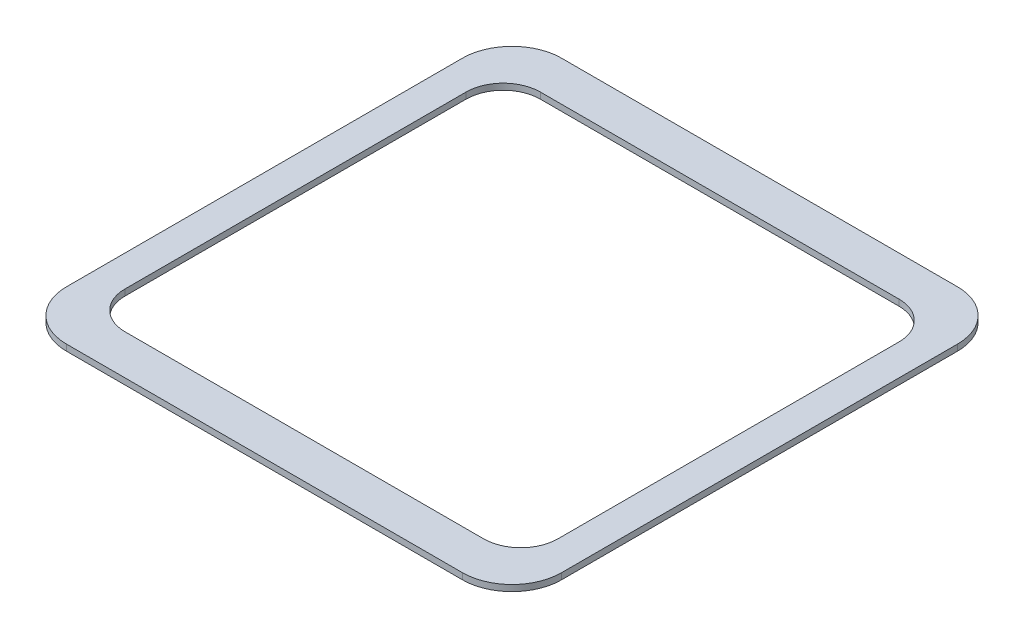
ISO-10303-21;
HEADER;
FILE_DESCRIPTION(('STEP AP214'),'2;1');
FILE_NAME('part.step','',(''),(''),'','','');
FILE_SCHEMA(('AUTOMOTIVE_DESIGN { 1 0 10303 214 1 1 1 1 }'));
ENDSEC;
DATA;
#1=APPLICATION_CONTEXT('core data for automotive mechanical design processes');
#2=APPLICATION_PROTOCOL_DEFINITION('international standard','automotive_design',2000,#1);
#3=PRODUCT_CONTEXT('',#1,'mechanical');
#4=PRODUCT('Part','Part','',(#3));
#5=PRODUCT_RELATED_PRODUCT_CATEGORY('part','',(#4));
#6=PRODUCT_DEFINITION_FORMATION('','',#4);
#7=PRODUCT_DEFINITION_CONTEXT('part definition',#1,'design');
#8=PRODUCT_DEFINITION('design','',#6,#7);
#9=PRODUCT_DEFINITION_SHAPE('','',#8);
#10=(LENGTH_UNIT() NAMED_UNIT(*) SI_UNIT(.MILLI.,.METRE.));
#11=(NAMED_UNIT(*) PLANE_ANGLE_UNIT() SI_UNIT($,.RADIAN.));
#12=(NAMED_UNIT(*) SI_UNIT($,.STERADIAN.) SOLID_ANGLE_UNIT());
#13=UNCERTAINTY_MEASURE_WITH_UNIT(LENGTH_MEASURE(1.E-05),#10,'distance_accuracy_value','');
#14=(GEOMETRIC_REPRESENTATION_CONTEXT(3) GLOBAL_UNCERTAINTY_ASSIGNED_CONTEXT((#13)) GLOBAL_UNIT_ASSIGNED_CONTEXT((#10,
#11,#12)) REPRESENTATION_CONTEXT('',''));
#15=CARTESIAN_POINT('',(0.,0.,0.));
#16=DIRECTION('',(0.,0.,1.));
#17=DIRECTION('',(1.,0.,0.));
#18=AXIS2_PLACEMENT_3D('',#15,#16,#17);
#19=CARTESIAN_POINT('',(50.8,-5.02919999999997,-50.8));
#20=DIRECTION('',(0.,-1.,0.));
#21=DIRECTION('',(0.,0.,-1.));
#22=AXIS2_PLACEMENT_3D('',#19,#20,#21);
#23=PLANE('',#22);
#24=CARTESIAN_POINT('',(50.8,-5.02919999999997,-50.8));
#25=DIRECTION('',(0.,-1.,0.));
#26=DIRECTION('',(0.,0.,-1.));
#27=AXIS2_PLACEMENT_3D('',#24,#25,#26);
#28=CIRCLE('',#27,12.7);
#29=CARTESIAN_POINT('',(50.7999999999999,-5.02919999999997,-63.5000000000001));
#30=VERTEX_POINT('',#29);
#31=CARTESIAN_POINT('',(63.5,-5.02919999999997,-50.8));
#32=VERTEX_POINT('',#31);
#33=EDGE_CURVE('E211',#30,#32,#28,.T.);
#34=ORIENTED_EDGE('',*,*,#33,.T.);
#35=DIRECTION('',(0.,0.,1.));
#36=VECTOR('',#35,1.);
#37=CARTESIAN_POINT('',(63.5,-5.02919999999997,-50.8));
#38=LINE('',#37,#36);
#39=CARTESIAN_POINT('',(63.4999999999999,-5.02919999999997,50.8));
#40=VERTEX_POINT('',#39);
#41=EDGE_CURVE('E214',#32,#40,#38,.T.);
#42=ORIENTED_EDGE('',*,*,#41,.T.);
#43=CARTESIAN_POINT('',(50.7999999999999,-5.02919999999997,50.8));
#44=DIRECTION('',(0.,-1.,0.));
#45=DIRECTION('',(0.,0.,-1.));
#46=AXIS2_PLACEMENT_3D('',#43,#44,#45);
#47=CIRCLE('',#46,12.7);
#48=CARTESIAN_POINT('',(50.7999999999999,-5.02919999999997,63.5));
#49=VERTEX_POINT('',#48);
#50=EDGE_CURVE('E217',#40,#49,#47,.T.);
#51=ORIENTED_EDGE('',*,*,#50,.T.);
#52=DIRECTION('',(-1.,0.,0.));
#53=VECTOR('',#52,1.);
#54=CARTESIAN_POINT('',(50.7999999999999,-5.02919999999997,63.5));
#55=LINE('',#54,#53);
#56=CARTESIAN_POINT('',(-50.8,-5.02919999999997,63.5));
#57=VERTEX_POINT('',#56);
#58=EDGE_CURVE('E219',#49,#57,#55,.T.);
#59=ORIENTED_EDGE('',*,*,#58,.T.);
#60=CARTESIAN_POINT('',(-50.8,-5.02919999999997,50.8));
#61=DIRECTION('',(0.,-1.,0.));
#62=DIRECTION('',(0.,0.,-1.));
#63=AXIS2_PLACEMENT_3D('',#60,#61,#62);
#64=CIRCLE('',#63,12.7);
#65=CARTESIAN_POINT('',(-63.4999999999999,-5.02919999999997,50.8));
#66=VERTEX_POINT('',#65);
#67=EDGE_CURVE('E221',#57,#66,#64,.T.);
#68=ORIENTED_EDGE('',*,*,#67,.T.);
#69=DIRECTION('',(0.,0.,-1.));
#70=VECTOR('',#69,1.);
#71=CARTESIAN_POINT('',(-63.4999999999999,-5.02919999999997,-50.8000000000001));
#72=LINE('',#71,#70);
#73=CARTESIAN_POINT('',(-63.4999999999999,-5.02919999999997,-50.8000000000001));
#74=VERTEX_POINT('',#73);
#75=EDGE_CURVE('E223',#66,#74,#72,.T.);
#76=ORIENTED_EDGE('',*,*,#75,.T.);
#77=CARTESIAN_POINT('',(-50.7999999999999,-5.02919999999997,-50.8));
#78=DIRECTION('',(0.,-1.,0.));
#79=DIRECTION('',(0.,0.,-1.));
#80=AXIS2_PLACEMENT_3D('',#77,#78,#79);
#81=CIRCLE('',#80,12.7);
#82=CARTESIAN_POINT('',(-50.7999999999999,-5.02919999999997,-63.5));
#83=VERTEX_POINT('',#82);
#84=EDGE_CURVE('E225',#74,#83,#81,.T.);
#85=ORIENTED_EDGE('',*,*,#84,.T.);
#86=DIRECTION('',(1.,0.,0.));
#87=VECTOR('',#86,1.);
#88=CARTESIAN_POINT('',(50.7999999999999,-5.02919999999997,-63.5000000000001));
#89=LINE('',#88,#87);
#90=EDGE_CURVE('E227',#83,#30,#89,.T.);
#91=ORIENTED_EDGE('',*,*,#90,.T.);
#92=EDGE_LOOP('',(#34,#42,#51,#59,#68,#76,#85,#91));
#93=FACE_BOUND('',#92,.T.);
#94=DIRECTION('',(1.,0.,0.));
#95=VECTOR('',#94,1.);
#96=CARTESIAN_POINT('',(-45.9922192067048,-5.02919999999997,-53.26253));
#97=LINE('',#96,#95);
#98=CARTESIAN_POINT('',(-45.9922192067048,-5.02919999999997,-53.26253));
#99=VERTEX_POINT('',#98);
#100=CARTESIAN_POINT('',(45.9922192067048,-5.02919999999997,-53.26253));
#101=VERTEX_POINT('',#100);
#102=EDGE_CURVE('E154',#99,#101,#97,.T.);
#103=ORIENTED_EDGE('',*,*,#102,.F.);
#104=CARTESIAN_POINT('',(-45.9922192067048,-5.02919999999997,-43.7388));
#105=DIRECTION('',(0.,-1.,0.));
#106=DIRECTION('',(0.,0.,-1.));
#107=AXIS2_PLACEMENT_3D('',#104,#105,#106);
#108=CIRCLE('',#107,9.52372999999999);
#109=CARTESIAN_POINT('',(-55.5159492067048,-5.02919999999997,-43.7388));
#110=VERTEX_POINT('',#109);
#111=EDGE_CURVE('E146',#110,#99,#108,.T.);
#112=ORIENTED_EDGE('',*,*,#111,.F.);
#113=DIRECTION('',(0.,0.,-1.));
#114=VECTOR('',#113,1.);
#115=CARTESIAN_POINT('',(-55.5159492067048,-5.02919999999997,43.7388));
#116=LINE('',#115,#114);
#117=CARTESIAN_POINT('',(-55.5159492067048,-5.02919999999997,43.7388));
#118=VERTEX_POINT('',#117);
#119=EDGE_CURVE('E179',#118,#110,#116,.T.);
#120=ORIENTED_EDGE('',*,*,#119,.F.);
#121=CARTESIAN_POINT('',(-45.9922192067048,-5.02919999999997,43.7388));
#122=DIRECTION('',(0.,-1.,0.));
#123=DIRECTION('',(0.,0.,-1.));
#124=AXIS2_PLACEMENT_3D('',#121,#122,#123);
#125=CIRCLE('',#124,9.52372999999999);
#126=CARTESIAN_POINT('',(-45.9922192067048,-5.02919999999997,53.26253));
#127=VERTEX_POINT('',#126);
#128=EDGE_CURVE('E177',#127,#118,#125,.T.);
#129=ORIENTED_EDGE('',*,*,#128,.F.);
#130=DIRECTION('',(-1.,0.,0.));
#131=VECTOR('',#130,1.);
#132=CARTESIAN_POINT('',(45.9922192067048,-5.02919999999997,53.26253));
#133=LINE('',#132,#131);
#134=CARTESIAN_POINT('',(45.9922192067048,-5.02919999999997,53.26253));
#135=VERTEX_POINT('',#134);
#136=EDGE_CURVE('E175',#135,#127,#133,.T.);
#137=ORIENTED_EDGE('',*,*,#136,.F.);
#138=CARTESIAN_POINT('',(45.9922192067048,-5.02919999999997,43.7388));
#139=DIRECTION('',(0.,-1.,0.));
#140=DIRECTION('',(0.,0.,-1.));
#141=AXIS2_PLACEMENT_3D('',#138,#139,#140);
#142=CIRCLE('',#141,9.52372999999999);
#143=CARTESIAN_POINT('',(55.5159492067048,-5.02919999999997,43.7388));
#144=VERTEX_POINT('',#143);
#145=EDGE_CURVE('E173',#144,#135,#142,.T.);
#146=ORIENTED_EDGE('',*,*,#145,.F.);
#147=DIRECTION('',(0.,0.,1.));
#148=VECTOR('',#147,1.);
#149=CARTESIAN_POINT('',(55.5159492067048,-5.02919999999997,-43.7388));
#150=LINE('',#149,#148);
#151=CARTESIAN_POINT('',(55.5159492067048,-5.02919999999997,-43.7388));
#152=VERTEX_POINT('',#151);
#153=EDGE_CURVE('E169',#152,#144,#150,.T.);
#154=ORIENTED_EDGE('',*,*,#153,.F.);
#155=CARTESIAN_POINT('',(45.9922192067048,-5.02919999999997,-43.7388));
#156=DIRECTION('',(0.,-1.,0.));
#157=DIRECTION('',(0.,0.,-1.));
#158=AXIS2_PLACEMENT_3D('',#155,#156,#157);
#159=CIRCLE('',#158,9.52372999999999);
#160=EDGE_CURVE('E167',#101,#152,#159,.T.);
#161=ORIENTED_EDGE('',*,*,#160,.F.);
#162=EDGE_LOOP('',(#103,#112,#120,#129,#137,#146,#154,#161));
#163=FACE_BOUND('',#162,.T.);
#164=ADVANCED_FACE('F33',(#93,#163),#23,.T.);
#165=CARTESIAN_POINT('',(50.8,-3.44169999999997,-50.8));
#166=DIRECTION('',(0.,-1.,0.));
#167=DIRECTION('',(0.,0.,-1.));
#168=AXIS2_PLACEMENT_3D('',#165,#166,#167);
#169=PLANE('',#168);
#170=CARTESIAN_POINT('',(50.8,-3.44169999999997,-50.8));
#171=DIRECTION('',(0.,-1.,0.));
#172=DIRECTION('',(0.,0.,-1.));
#173=AXIS2_PLACEMENT_3D('',#170,#171,#172);
#174=CIRCLE('',#173,12.7);
#175=CARTESIAN_POINT('',(50.7999999999999,-3.44169999999997,-63.5000000000001));
#176=VERTEX_POINT('',#175);
#177=CARTESIAN_POINT('',(63.5,-3.44169999999997,-50.8));
#178=VERTEX_POINT('',#177);
#179=EDGE_CURVE('E162',#176,#178,#174,.T.);
#180=ORIENTED_EDGE('',*,*,#179,.F.);
#181=DIRECTION('',(1.,0.,0.));
#182=VECTOR('',#181,1.);
#183=CARTESIAN_POINT('',(50.7999999999999,-3.44169999999997,-63.5000000000001));
#184=LINE('',#183,#182);
#185=CARTESIAN_POINT('',(-50.7999999999999,-3.44169999999997,-63.5));
#186=VERTEX_POINT('',#185);
#187=EDGE_CURVE('E215',#186,#176,#184,.T.);
#188=ORIENTED_EDGE('',*,*,#187,.F.);
#189=CARTESIAN_POINT('',(-50.7999999999999,-3.44169999999997,-50.8));
#190=DIRECTION('',(0.,-1.,0.));
#191=DIRECTION('',(0.,0.,-1.));
#192=AXIS2_PLACEMENT_3D('',#189,#190,#191);
#193=CIRCLE('',#192,12.7);
#194=CARTESIAN_POINT('',(-63.4999999999999,-3.44169999999997,-50.8000000000001));
#195=VERTEX_POINT('',#194);
#196=EDGE_CURVE('E242',#195,#186,#193,.T.);
#197=ORIENTED_EDGE('',*,*,#196,.F.);
#198=DIRECTION('',(0.,0.,-1.));
#199=VECTOR('',#198,1.);
#200=CARTESIAN_POINT('',(-63.4999999999999,-3.44169999999997,-50.8000000000001));
#201=LINE('',#200,#199);
#202=CARTESIAN_POINT('',(-63.4999999999999,-3.44169999999997,50.8));
#203=VERTEX_POINT('',#202);
#204=EDGE_CURVE('E240',#203,#195,#201,.T.);
#205=ORIENTED_EDGE('',*,*,#204,.F.);
#206=CARTESIAN_POINT('',(-50.8,-3.44169999999997,50.8));
#207=DIRECTION('',(0.,-1.,0.));
#208=DIRECTION('',(0.,0.,-1.));
#209=AXIS2_PLACEMENT_3D('',#206,#207,#208);
#210=CIRCLE('',#209,12.7);
#211=CARTESIAN_POINT('',(-50.8,-3.44169999999997,63.5));
#212=VERTEX_POINT('',#211);
#213=EDGE_CURVE('E238',#212,#203,#210,.T.);
#214=ORIENTED_EDGE('',*,*,#213,.F.);
#215=DIRECTION('',(-1.,0.,0.));
#216=VECTOR('',#215,1.);
#217=CARTESIAN_POINT('',(50.7999999999999,-3.44169999999997,63.5));
#218=LINE('',#217,#216);
#219=CARTESIAN_POINT('',(50.7999999999999,-3.44169999999997,63.5));
#220=VERTEX_POINT('',#219);
#221=EDGE_CURVE('E236',#220,#212,#218,.T.);
#222=ORIENTED_EDGE('',*,*,#221,.F.);
#223=CARTESIAN_POINT('',(50.7999999999999,-3.44169999999997,50.8));
#224=DIRECTION('',(0.,-1.,0.));
#225=DIRECTION('',(0.,0.,-1.));
#226=AXIS2_PLACEMENT_3D('',#223,#224,#225);
#227=CIRCLE('',#226,12.7);
#228=CARTESIAN_POINT('',(63.4999999999999,-3.44169999999997,50.8));
#229=VERTEX_POINT('',#228);
#230=EDGE_CURVE('E234',#229,#220,#227,.T.);
#231=ORIENTED_EDGE('',*,*,#230,.F.);
#232=DIRECTION('',(0.,0.,1.));
#233=VECTOR('',#232,1.);
#234=CARTESIAN_POINT('',(63.5,-3.44169999999997,-50.8));
#235=LINE('',#234,#233);
#236=EDGE_CURVE('E232',#178,#229,#235,.T.);
#237=ORIENTED_EDGE('',*,*,#236,.F.);
#238=EDGE_LOOP('',(#180,#188,#197,#205,#214,#222,#231,#237));
#239=FACE_BOUND('',#238,.T.);
#240=CARTESIAN_POINT('',(-45.9922192067048,-3.44169999999997,-43.7388));
#241=DIRECTION('',(0.,-1.,0.));
#242=DIRECTION('',(0.,0.,-1.));
#243=AXIS2_PLACEMENT_3D('',#240,#241,#242);
#244=CIRCLE('',#243,9.52372999999999);
#245=CARTESIAN_POINT('',(-55.5159492067048,-3.44169999999997,-43.7388));
#246=VERTEX_POINT('',#245);
#247=CARTESIAN_POINT('',(-45.9922192067048,-3.44169999999997,-53.26253));
#248=VERTEX_POINT('',#247);
#249=EDGE_CURVE('E56',#246,#248,#244,.T.);
#250=ORIENTED_EDGE('',*,*,#249,.T.);
#251=DIRECTION('',(1.,0.,0.));
#252=VECTOR('',#251,1.);
#253=CARTESIAN_POINT('',(-45.9922192067048,-3.44169999999997,-53.26253));
#254=LINE('',#253,#252);
#255=CARTESIAN_POINT('',(45.9922192067048,-3.44169999999997,-53.26253));
#256=VERTEX_POINT('',#255);
#257=EDGE_CURVE('E161',#248,#256,#254,.T.);
#258=ORIENTED_EDGE('',*,*,#257,.T.);
#259=CARTESIAN_POINT('',(45.9922192067048,-3.44169999999997,-43.7388));
#260=DIRECTION('',(0.,-1.,0.));
#261=DIRECTION('',(0.,0.,-1.));
#262=AXIS2_PLACEMENT_3D('',#259,#260,#261);
#263=CIRCLE('',#262,9.52372999999999);
#264=CARTESIAN_POINT('',(55.5159492067048,-3.44169999999997,-43.7388));
#265=VERTEX_POINT('',#264);
#266=EDGE_CURVE('E183',#256,#265,#263,.T.);
#267=ORIENTED_EDGE('',*,*,#266,.T.);
#268=DIRECTION('',(0.,0.,1.));
#269=VECTOR('',#268,1.);
#270=CARTESIAN_POINT('',(55.5159492067048,-3.44169999999997,-43.7388));
#271=LINE('',#270,#269);
#272=CARTESIAN_POINT('',(55.5159492067048,-3.44169999999997,43.7388));
#273=VERTEX_POINT('',#272);
#274=EDGE_CURVE('E186',#265,#273,#271,.T.);
#275=ORIENTED_EDGE('',*,*,#274,.T.);
#276=CARTESIAN_POINT('',(45.9922192067048,-3.44169999999997,43.7388));
#277=DIRECTION('',(0.,-1.,0.));
#278=DIRECTION('',(0.,0.,-1.));
#279=AXIS2_PLACEMENT_3D('',#276,#277,#278);
#280=CIRCLE('',#279,9.52372999999999);
#281=CARTESIAN_POINT('',(45.9922192067048,-3.44169999999997,53.26253));
#282=VERTEX_POINT('',#281);
#283=EDGE_CURVE('E189',#273,#282,#280,.T.);
#284=ORIENTED_EDGE('',*,*,#283,.T.);
#285=DIRECTION('',(-1.,0.,0.));
#286=VECTOR('',#285,1.);
#287=CARTESIAN_POINT('',(45.9922192067048,-3.44169999999997,53.26253));
#288=LINE('',#287,#286);
#289=CARTESIAN_POINT('',(-45.9922192067048,-3.44169999999997,53.26253));
#290=VERTEX_POINT('',#289);
#291=EDGE_CURVE('E192',#282,#290,#288,.T.);
#292=ORIENTED_EDGE('',*,*,#291,.T.);
#293=CARTESIAN_POINT('',(-45.9922192067048,-3.44169999999997,43.7388));
#294=DIRECTION('',(0.,-1.,0.));
#295=DIRECTION('',(0.,0.,-1.));
#296=AXIS2_PLACEMENT_3D('',#293,#294,#295);
#297=CIRCLE('',#296,9.52372999999999);
#298=CARTESIAN_POINT('',(-55.5159492067048,-3.44169999999997,43.7388));
#299=VERTEX_POINT('',#298);
#300=EDGE_CURVE('E195',#290,#299,#297,.T.);
#301=ORIENTED_EDGE('',*,*,#300,.T.);
#302=DIRECTION('',(0.,0.,-1.));
#303=VECTOR('',#302,1.);
#304=CARTESIAN_POINT('',(-55.5159492067048,-3.44169999999997,0.));
#305=LINE('',#304,#303);
#306=EDGE_CURVE('E155',#299,#246,#305,.T.);
#307=ORIENTED_EDGE('',*,*,#306,.T.);
#308=EDGE_LOOP('',(#250,#258,#267,#275,#284,#292,#301,#307));
#309=FACE_BOUND('',#308,.T.);
#310=ADVANCED_FACE('F272',(#239,#309),#169,.F.);
#311=CARTESIAN_POINT('',(50.8,-5.02919999999997,-50.8));
#312=DIRECTION('',(0.,1.,0.));
#313=DIRECTION('',(0.,0.,1.));
#314=AXIS2_PLACEMENT_3D('',#311,#312,#313);
#315=CYLINDRICAL_SURFACE('',#314,12.7);
#316=ORIENTED_EDGE('',*,*,#179,.T.);
#317=DIRECTION('',(0.,1.,0.));
#318=VECTOR('',#317,1.);
#319=CARTESIAN_POINT('',(63.5,-5.02919999999997,-50.8));
#320=LINE('',#319,#318);
#321=EDGE_CURVE('E11',#32,#178,#320,.T.);
#322=ORIENTED_EDGE('',*,*,#321,.F.);
#323=ORIENTED_EDGE('',*,*,#33,.F.);
#324=DIRECTION('',(0.,1.,0.));
#325=VECTOR('',#324,1.);
#326=CARTESIAN_POINT('',(50.7999999999999,-5.02919999999997,-63.5000000000001));
#327=LINE('',#326,#325);
#328=EDGE_CURVE('E229',#30,#176,#327,.T.);
#329=ORIENTED_EDGE('',*,*,#328,.T.);
#330=EDGE_LOOP('',(#316,#322,#323,#329));
#331=FACE_BOUND('',#330,.T.);
#332=ADVANCED_FACE('F35',(#331),#315,.T.);
#333=CARTESIAN_POINT('',(63.5,-5.02919999999997,-50.8));
#334=DIRECTION('',(-1.,0.,0.));
#335=DIRECTION('',(0.,0.,1.));
#336=AXIS2_PLACEMENT_3D('',#333,#334,#335);
#337=PLANE('',#336);
#338=ORIENTED_EDGE('',*,*,#236,.T.);
#339=DIRECTION('',(0.,1.,0.));
#340=VECTOR('',#339,1.);
#341=CARTESIAN_POINT('',(63.4999999999999,-5.02919999999997,50.8));
#342=LINE('',#341,#340);
#343=EDGE_CURVE('E41',#40,#229,#342,.T.);
#344=ORIENTED_EDGE('',*,*,#343,.F.);
#345=ORIENTED_EDGE('',*,*,#41,.F.);
#346=ORIENTED_EDGE('',*,*,#321,.T.);
#347=EDGE_LOOP('',(#338,#344,#345,#346));
#348=FACE_BOUND('',#347,.T.);
#349=ADVANCED_FACE('F289',(#348),#337,.F.);
#350=CARTESIAN_POINT('',(50.7999999999999,-5.02919999999997,50.8));
#351=DIRECTION('',(0.,1.,0.));
#352=DIRECTION('',(0.,0.,1.));
#353=AXIS2_PLACEMENT_3D('',#350,#351,#352);
#354=CYLINDRICAL_SURFACE('',#353,12.7);
#355=ORIENTED_EDGE('',*,*,#230,.T.);
#356=DIRECTION('',(0.,1.,0.));
#357=VECTOR('',#356,1.);
#358=CARTESIAN_POINT('',(50.7999999999999,-5.02919999999997,63.5));
#359=LINE('',#358,#357);
#360=EDGE_CURVE('E259',#49,#220,#359,.T.);
#361=ORIENTED_EDGE('',*,*,#360,.F.);
#362=ORIENTED_EDGE('',*,*,#50,.F.);
#363=ORIENTED_EDGE('',*,*,#343,.T.);
#364=EDGE_LOOP('',(#355,#361,#362,#363));
#365=FACE_BOUND('',#364,.T.);
#366=ADVANCED_FACE('F266',(#365),#354,.T.);
#367=CARTESIAN_POINT('',(50.7999999999999,-5.02919999999997,63.5));
#368=DIRECTION('',(0.,0.,-1.));
#369=DIRECTION('',(-1.,0.,0.));
#370=AXIS2_PLACEMENT_3D('',#367,#368,#369);
#371=PLANE('',#370);
#372=ORIENTED_EDGE('',*,*,#221,.T.);
#373=DIRECTION('',(0.,1.,0.));
#374=VECTOR('',#373,1.);
#375=CARTESIAN_POINT('',(-50.8,-5.02919999999997,63.5));
#376=LINE('',#375,#374);
#377=EDGE_CURVE('E256',#57,#212,#376,.T.);
#378=ORIENTED_EDGE('',*,*,#377,.F.);
#379=ORIENTED_EDGE('',*,*,#58,.F.);
#380=ORIENTED_EDGE('',*,*,#360,.T.);
#381=EDGE_LOOP('',(#372,#378,#379,#380));
#382=FACE_BOUND('',#381,.T.);
#383=ADVANCED_FACE('F278',(#382),#371,.F.);
#384=CARTESIAN_POINT('',(-50.8,-5.02919999999997,50.8));
#385=DIRECTION('',(0.,1.,0.));
#386=DIRECTION('',(0.,0.,1.));
#387=AXIS2_PLACEMENT_3D('',#384,#385,#386);
#388=CYLINDRICAL_SURFACE('',#387,12.7);
#389=ORIENTED_EDGE('',*,*,#213,.T.);
#390=DIRECTION('',(0.,1.,0.));
#391=VECTOR('',#390,1.);
#392=CARTESIAN_POINT('',(-63.4999999999999,-5.02919999999997,50.8));
#393=LINE('',#392,#391);
#394=EDGE_CURVE('E253',#66,#203,#393,.T.);
#395=ORIENTED_EDGE('',*,*,#394,.F.);
#396=ORIENTED_EDGE('',*,*,#67,.F.);
#397=ORIENTED_EDGE('',*,*,#377,.T.);
#398=EDGE_LOOP('',(#389,#395,#396,#397));
#399=FACE_BOUND('',#398,.T.);
#400=ADVANCED_FACE('F282',(#399),#388,.T.);
#401=CARTESIAN_POINT('',(-63.4999999999999,-5.02919999999997,-50.8000000000001));
#402=DIRECTION('',(1.,0.,0.));
#403=DIRECTION('',(0.,0.,-1.));
#404=AXIS2_PLACEMENT_3D('',#401,#402,#403);
#405=PLANE('',#404);
#406=ORIENTED_EDGE('',*,*,#204,.T.);
#407=DIRECTION('',(0.,1.,0.));
#408=VECTOR('',#407,1.);
#409=CARTESIAN_POINT('',(-63.4999999999999,-5.02919999999997,-50.8000000000001));
#410=LINE('',#409,#408);
#411=EDGE_CURVE('E250',#74,#195,#410,.T.);
#412=ORIENTED_EDGE('',*,*,#411,.F.);
#413=ORIENTED_EDGE('',*,*,#75,.F.);
#414=ORIENTED_EDGE('',*,*,#394,.T.);
#415=EDGE_LOOP('',(#406,#412,#413,#414));
#416=FACE_BOUND('',#415,.T.);
#417=ADVANCED_FACE('F302',(#416),#405,.F.);
#418=CARTESIAN_POINT('',(-50.7999999999999,-5.02919999999997,-50.8));
#419=DIRECTION('',(0.,1.,0.));
#420=DIRECTION('',(0.,0.,1.));
#421=AXIS2_PLACEMENT_3D('',#418,#419,#420);
#422=CYLINDRICAL_SURFACE('',#421,12.7);
#423=ORIENTED_EDGE('',*,*,#196,.T.);
#424=DIRECTION('',(0.,1.,0.));
#425=VECTOR('',#424,1.);
#426=CARTESIAN_POINT('',(-50.7999999999999,-5.02919999999997,-63.5));
#427=LINE('',#426,#425);
#428=EDGE_CURVE('E247',#83,#186,#427,.T.);
#429=ORIENTED_EDGE('',*,*,#428,.F.);
#430=ORIENTED_EDGE('',*,*,#84,.F.);
#431=ORIENTED_EDGE('',*,*,#411,.T.);
#432=EDGE_LOOP('',(#423,#429,#430,#431));
#433=FACE_BOUND('',#432,.T.);
#434=ADVANCED_FACE('F300',(#433),#422,.T.);
#435=CARTESIAN_POINT('',(50.7999999999999,-5.02919999999997,-63.5000000000001));
#436=DIRECTION('',(0.,0.,1.));
#437=DIRECTION('',(1.,0.,0.));
#438=AXIS2_PLACEMENT_3D('',#435,#436,#437);
#439=PLANE('',#438);
#440=ORIENTED_EDGE('',*,*,#187,.T.);
#441=ORIENTED_EDGE('',*,*,#328,.F.);
#442=ORIENTED_EDGE('',*,*,#90,.F.);
#443=ORIENTED_EDGE('',*,*,#428,.T.);
#444=EDGE_LOOP('',(#440,#441,#442,#443));
#445=FACE_BOUND('',#444,.T.);
#446=ADVANCED_FACE('F295',(#445),#439,.F.);
#447=CARTESIAN_POINT('',(-45.9922192067048,-5.02919999999997,-43.7388));
#448=DIRECTION('',(0.,1.,0.));
#449=DIRECTION('',(0.,0.,1.));
#450=AXIS2_PLACEMENT_3D('',#447,#448,#449);
#451=CYLINDRICAL_SURFACE('',#450,9.52372999999999);
#452=ORIENTED_EDGE('',*,*,#249,.F.);
#453=DIRECTION('',(0.,1.,0.));
#454=VECTOR('',#453,1.);
#455=CARTESIAN_POINT('',(-55.5159492067048,-5.02919999999997,-43.7388));
#456=LINE('',#455,#454);
#457=EDGE_CURVE('E150',#110,#246,#456,.T.);
#458=ORIENTED_EDGE('',*,*,#457,.F.);
#459=ORIENTED_EDGE('',*,*,#111,.T.);
#460=DIRECTION('',(0.,1.,0.));
#461=VECTOR('',#460,1.);
#462=CARTESIAN_POINT('',(-45.9922192067048,-5.02919999999997,-53.26253));
#463=LINE('',#462,#461);
#464=EDGE_CURVE('E149',#99,#248,#463,.T.);
#465=ORIENTED_EDGE('',*,*,#464,.T.);
#466=EDGE_LOOP('',(#452,#458,#459,#465));
#467=FACE_BOUND('',#466,.T.);
#468=ADVANCED_FACE('F148',(#467),#451,.F.);
#469=CARTESIAN_POINT('',(-45.9922192067048,-5.02919999999997,-53.26253));
#470=DIRECTION('',(0.,0.,1.));
#471=DIRECTION('',(1.,0.,0.));
#472=AXIS2_PLACEMENT_3D('',#469,#470,#471);
#473=PLANE('',#472);
#474=ORIENTED_EDGE('',*,*,#257,.F.);
#475=ORIENTED_EDGE('',*,*,#464,.F.);
#476=ORIENTED_EDGE('',*,*,#102,.T.);
#477=DIRECTION('',(0.,1.,0.));
#478=VECTOR('',#477,1.);
#479=CARTESIAN_POINT('',(45.9922192067048,-5.02919999999997,-53.26253));
#480=LINE('',#479,#478);
#481=EDGE_CURVE('E163',#101,#256,#480,.T.);
#482=ORIENTED_EDGE('',*,*,#481,.T.);
#483=EDGE_LOOP('',(#474,#475,#476,#482));
#484=FACE_BOUND('',#483,.T.);
#485=ADVANCED_FACE('F158',(#484),#473,.T.);
#486=CARTESIAN_POINT('',(45.9922192067048,-5.02919999999997,-43.7388));
#487=DIRECTION('',(0.,1.,0.));
#488=DIRECTION('',(0.,0.,1.));
#489=AXIS2_PLACEMENT_3D('',#486,#487,#488);
#490=CYLINDRICAL_SURFACE('',#489,9.52372999999999);
#491=ORIENTED_EDGE('',*,*,#266,.F.);
#492=ORIENTED_EDGE('',*,*,#481,.F.);
#493=ORIENTED_EDGE('',*,*,#160,.T.);
#494=DIRECTION('',(0.,1.,0.));
#495=VECTOR('',#494,1.);
#496=CARTESIAN_POINT('',(55.5159492067048,-5.02919999999997,-43.7388));
#497=LINE('',#496,#495);
#498=EDGE_CURVE('E208',#152,#265,#497,.T.);
#499=ORIENTED_EDGE('',*,*,#498,.T.);
#500=EDGE_LOOP('',(#491,#492,#493,#499));
#501=FACE_BOUND('',#500,.T.);
#502=ADVANCED_FACE('F327',(#501),#490,.F.);
#503=CARTESIAN_POINT('',(55.5159492067048,-5.02919999999997,-43.7388));
#504=DIRECTION('',(-1.,0.,0.));
#505=DIRECTION('',(0.,0.,1.));
#506=AXIS2_PLACEMENT_3D('',#503,#504,#505);
#507=PLANE('',#506);
#508=ORIENTED_EDGE('',*,*,#274,.F.);
#509=ORIENTED_EDGE('',*,*,#498,.F.);
#510=ORIENTED_EDGE('',*,*,#153,.T.);
#511=DIRECTION('',(0.,1.,0.));
#512=VECTOR('',#511,1.);
#513=CARTESIAN_POINT('',(55.5159492067048,-5.02919999999997,43.7388));
#514=LINE('',#513,#512);
#515=EDGE_CURVE('E206',#144,#273,#514,.T.);
#516=ORIENTED_EDGE('',*,*,#515,.T.);
#517=EDGE_LOOP('',(#508,#509,#510,#516));
#518=FACE_BOUND('',#517,.T.);
#519=ADVANCED_FACE('F331',(#518),#507,.T.);
#520=CARTESIAN_POINT('',(45.9922192067048,-5.02919999999997,43.7388));
#521=DIRECTION('',(0.,1.,0.));
#522=DIRECTION('',(0.,0.,1.));
#523=AXIS2_PLACEMENT_3D('',#520,#521,#522);
#524=CYLINDRICAL_SURFACE('',#523,9.52372999999999);
#525=ORIENTED_EDGE('',*,*,#283,.F.);
#526=ORIENTED_EDGE('',*,*,#515,.F.);
#527=ORIENTED_EDGE('',*,*,#145,.T.);
#528=DIRECTION('',(0.,1.,0.));
#529=VECTOR('',#528,1.);
#530=CARTESIAN_POINT('',(45.9922192067048,-5.02919999999997,53.26253));
#531=LINE('',#530,#529);
#532=EDGE_CURVE('E204',#135,#282,#531,.T.);
#533=ORIENTED_EDGE('',*,*,#532,.T.);
#534=EDGE_LOOP('',(#525,#526,#527,#533));
#535=FACE_BOUND('',#534,.T.);
#536=ADVANCED_FACE('F337',(#535),#524,.F.);
#537=CARTESIAN_POINT('',(45.9922192067048,-5.02919999999997,53.26253));
#538=DIRECTION('',(0.,0.,-1.));
#539=DIRECTION('',(-1.,0.,0.));
#540=AXIS2_PLACEMENT_3D('',#537,#538,#539);
#541=PLANE('',#540);
#542=ORIENTED_EDGE('',*,*,#291,.F.);
#543=ORIENTED_EDGE('',*,*,#532,.F.);
#544=ORIENTED_EDGE('',*,*,#136,.T.);
#545=DIRECTION('',(0.,1.,0.));
#546=VECTOR('',#545,1.);
#547=CARTESIAN_POINT('',(-45.9922192067048,-5.02919999999997,53.26253));
#548=LINE('',#547,#546);
#549=EDGE_CURVE('E202',#127,#290,#548,.T.);
#550=ORIENTED_EDGE('',*,*,#549,.T.);
#551=EDGE_LOOP('',(#542,#543,#544,#550));
#552=FACE_BOUND('',#551,.T.);
#553=ADVANCED_FACE('F341',(#552),#541,.T.);
#554=CARTESIAN_POINT('',(-45.9922192067048,-5.02919999999997,43.7388));
#555=DIRECTION('',(0.,1.,0.));
#556=DIRECTION('',(0.,0.,1.));
#557=AXIS2_PLACEMENT_3D('',#554,#555,#556);
#558=CYLINDRICAL_SURFACE('',#557,9.52372999999999);
#559=ORIENTED_EDGE('',*,*,#300,.F.);
#560=ORIENTED_EDGE('',*,*,#549,.F.);
#561=ORIENTED_EDGE('',*,*,#128,.T.);
#562=DIRECTION('',(0.,1.,0.));
#563=VECTOR('',#562,1.);
#564=CARTESIAN_POINT('',(-55.5159492067048,-5.02919999999997,43.7388));
#565=LINE('',#564,#563);
#566=EDGE_CURVE('E48',#118,#299,#565,.T.);
#567=ORIENTED_EDGE('',*,*,#566,.T.);
#568=EDGE_LOOP('',(#559,#560,#561,#567));
#569=FACE_BOUND('',#568,.T.);
#570=ADVANCED_FACE('F345',(#569),#558,.F.);
#571=CARTESIAN_POINT('',(-55.5159492067048,-5.02919999999997,0.));
#572=DIRECTION('',(1.,0.,0.));
#573=DIRECTION('',(0.,0.,-1.));
#574=AXIS2_PLACEMENT_3D('',#571,#572,#573);
#575=PLANE('',#574);
#576=ORIENTED_EDGE('',*,*,#306,.F.);
#577=ORIENTED_EDGE('',*,*,#566,.F.);
#578=ORIENTED_EDGE('',*,*,#119,.T.);
#579=ORIENTED_EDGE('',*,*,#457,.T.);
#580=EDGE_LOOP('',(#576,#577,#578,#579));
#581=FACE_BOUND('',#580,.T.);
#582=ADVANCED_FACE('F349',(#581),#575,.T.);
#583=CLOSED_SHELL('',(#164,#310,#332,#349,#366,#383,#400,#417,#434,#446,#468,#485,#502,#519,
#536,#553,#570,#582));
#584=MANIFOLD_SOLID_BREP('B2',#583);
#585=ADVANCED_BREP_SHAPE_REPRESENTATION('',(#18,#584),#14);
#586=SHAPE_DEFINITION_REPRESENTATION(#9,#585);
ENDSEC;
END-ISO-10303-21;
